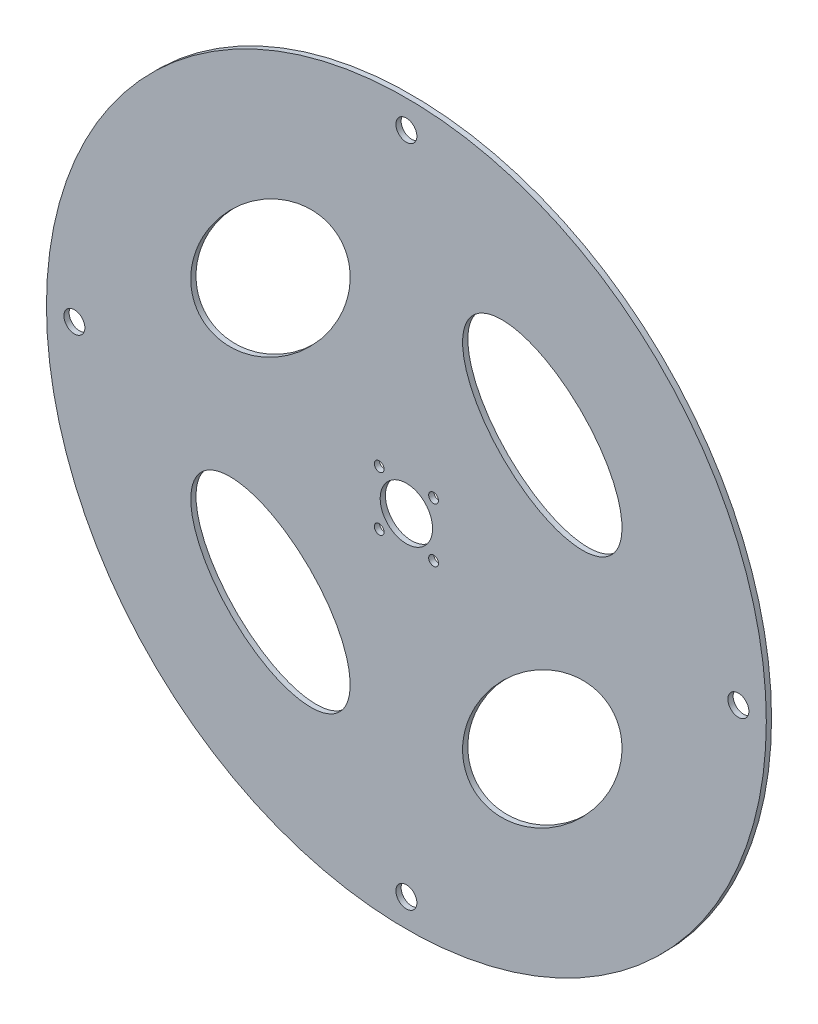
ISO-10303-21;
HEADER;
FILE_DESCRIPTION(('STEP AP214'),'2;1');
FILE_NAME('part.step','',(''),(''),'','','');
FILE_SCHEMA(('AUTOMOTIVE_DESIGN { 1 0 10303 214 1 1 1 1 }'));
ENDSEC;
DATA;
#1=APPLICATION_CONTEXT('core data for automotive mechanical design processes');
#2=APPLICATION_PROTOCOL_DEFINITION('international standard','automotive_design',2000,#1);
#3=PRODUCT_CONTEXT('',#1,'mechanical');
#4=PRODUCT('Part','Part','',(#3));
#5=PRODUCT_RELATED_PRODUCT_CATEGORY('part','',(#4));
#6=PRODUCT_DEFINITION_FORMATION('','',#4);
#7=PRODUCT_DEFINITION_CONTEXT('part definition',#1,'design');
#8=PRODUCT_DEFINITION('design','',#6,#7);
#9=PRODUCT_DEFINITION_SHAPE('','',#8);
#10=(LENGTH_UNIT() NAMED_UNIT(*) SI_UNIT(.MILLI.,.METRE.));
#11=(NAMED_UNIT(*) PLANE_ANGLE_UNIT() SI_UNIT($,.RADIAN.));
#12=(NAMED_UNIT(*) SI_UNIT($,.STERADIAN.) SOLID_ANGLE_UNIT());
#13=UNCERTAINTY_MEASURE_WITH_UNIT(LENGTH_MEASURE(1.E-05),#10,'distance_accuracy_value','');
#14=(GEOMETRIC_REPRESENTATION_CONTEXT(3) GLOBAL_UNCERTAINTY_ASSIGNED_CONTEXT((#13)) GLOBAL_UNIT_ASSIGNED_CONTEXT((#10,
#11,#12)) REPRESENTATION_CONTEXT('',''));
#15=CARTESIAN_POINT('',(0.,0.,0.));
#16=DIRECTION('',(0.,0.,1.));
#17=DIRECTION('',(1.,0.,0.));
#18=AXIS2_PLACEMENT_3D('',#15,#16,#17);
#19=CARTESIAN_POINT('',(0.,0.,1.5));
#20=DIRECTION('',(0.,0.,-1.));
#21=DIRECTION('',(-1.,0.,0.));
#22=AXIS2_PLACEMENT_3D('',#19,#20,#21);
#23=CYLINDRICAL_SURFACE('',#22,103.);
#24=CARTESIAN_POINT('',(0.,0.,1.5));
#25=DIRECTION('',(0.,0.,1.));
#26=DIRECTION('',(1.,0.,0.));
#27=AXIS2_PLACEMENT_3D('',#24,#25,#26);
#28=CIRCLE('',#27,103.);
#29=CARTESIAN_POINT('',(103.,0.,1.5));
#30=VERTEX_POINT('',#29);
#31=EDGE_CURVE('E10',#30,#30,#28,.T.);
#32=ORIENTED_EDGE('',*,*,#31,.F.);
#33=EDGE_LOOP('',(#32));
#34=FACE_BOUND('',#33,.T.);
#35=CARTESIAN_POINT('',(0.,0.,0.));
#36=DIRECTION('',(0.,0.,1.));
#37=DIRECTION('',(1.,0.,0.));
#38=AXIS2_PLACEMENT_3D('',#35,#36,#37);
#39=CIRCLE('',#38,103.);
#40=CARTESIAN_POINT('',(103.,0.,0.));
#41=VERTEX_POINT('',#40);
#42=EDGE_CURVE('E37',#41,#41,#39,.T.);
#43=ORIENTED_EDGE('',*,*,#42,.T.);
#44=EDGE_LOOP('',(#43));
#45=FACE_BOUND('',#44,.T.);
#46=ADVANCED_FACE('F40',(#34,#45),#23,.T.);
#47=CARTESIAN_POINT('',(0.,0.,1.5));
#48=DIRECTION('',(0.,0.,1.));
#49=DIRECTION('',(1.,0.,0.));
#50=AXIS2_PLACEMENT_3D('',#47,#48,#49);
#51=PLANE('',#50);
#52=CARTESIAN_POINT('',(7.77817459305194,-7.7781745930521,1.5));
#53=DIRECTION('',(0.,0.,1.));
#54=DIRECTION('',(1.,0.,0.));
#55=AXIS2_PLACEMENT_3D('',#52,#53,#54);
#56=CIRCLE('',#55,1.4);
#57=CARTESIAN_POINT('',(9.17817459305194,-7.7781745930521,1.5));
#58=VERTEX_POINT('',#57);
#59=EDGE_CURVE('E307',#58,#58,#56,.T.);
#60=ORIENTED_EDGE('',*,*,#59,.F.);
#61=EDGE_LOOP('',(#60));
#62=FACE_BOUND('',#61,.T.);
#63=CARTESIAN_POINT('',(7.77817459305208,7.77817459305197,1.5));
#64=DIRECTION('',(0.,0.,1.));
#65=DIRECTION('',(1.,0.,0.));
#66=AXIS2_PLACEMENT_3D('',#63,#64,#65);
#67=CIRCLE('',#66,1.4);
#68=CARTESIAN_POINT('',(9.17817459305208,7.77817459305197,1.5));
#69=VERTEX_POINT('',#68);
#70=EDGE_CURVE('E312',#69,#69,#67,.T.);
#71=ORIENTED_EDGE('',*,*,#70,.F.);
#72=EDGE_LOOP('',(#71));
#73=FACE_BOUND('',#72,.T.);
#74=CARTESIAN_POINT('',(-7.77817459305199,7.77817459305205,1.5));
#75=DIRECTION('',(0.,0.,1.));
#76=DIRECTION('',(1.,0.,0.));
#77=AXIS2_PLACEMENT_3D('',#74,#75,#76);
#78=CIRCLE('',#77,1.4);
#79=CARTESIAN_POINT('',(-6.378174593052,7.77817459305205,1.5));
#80=VERTEX_POINT('',#79);
#81=EDGE_CURVE('E316',#80,#80,#78,.T.);
#82=ORIENTED_EDGE('',*,*,#81,.F.);
#83=EDGE_LOOP('',(#82));
#84=FACE_BOUND('',#83,.T.);
#85=CARTESIAN_POINT('',(-7.77817459305202,-7.77817459305202,1.5));
#86=DIRECTION('',(0.,0.,1.));
#87=DIRECTION('',(1.,0.,0.));
#88=AXIS2_PLACEMENT_3D('',#85,#86,#87);
#89=CIRCLE('',#88,1.4);
#90=CARTESIAN_POINT('',(-6.37817459305202,-7.77817459305202,1.5));
#91=VERTEX_POINT('',#90);
#92=EDGE_CURVE('E254',#91,#91,#89,.T.);
#93=ORIENTED_EDGE('',*,*,#92,.F.);
#94=EDGE_LOOP('',(#93));
#95=FACE_BOUND('',#94,.T.);
#96=CARTESIAN_POINT('',(38.8908729652602,38.89087296526,1.5));
#97=DIRECTION('',(0.,0.,-1.));
#98=DIRECTION('',(0.707106781186545,-0.70710678118655,0.));
#99=AXIS2_PLACEMENT_3D('',#96,#97,#98);
#100=ELLIPSE('',#99,28.,16.);
#101=CARTESIAN_POINT('',(58.6898628384835,19.0918830920366,1.5));
#102=VERTEX_POINT('',#101);
#103=EDGE_CURVE('E230',#102,#102,#100,.T.);
#104=ORIENTED_EDGE('',*,*,#103,.T.);
#105=EDGE_LOOP('',(#104));
#106=FACE_BOUND('',#105,.T.);
#107=CARTESIAN_POINT('',(38.8908729652601,-38.8908729652601,1.5));
#108=DIRECTION('',(0.,0.,-1.));
#109=DIRECTION('',(-0.707106781186547,-0.707106781186548,0.));
#110=AXIS2_PLACEMENT_3D('',#107,#108,#109);
#111=ELLIPSE('',#110,28.,16.);
#112=CARTESIAN_POINT('',(19.0918830920368,-58.6898628384834,1.5));
#113=VERTEX_POINT('',#112);
#114=EDGE_CURVE('E237',#113,#113,#111,.T.);
#115=ORIENTED_EDGE('',*,*,#114,.T.);
#116=EDGE_LOOP('',(#115));
#117=FACE_BOUND('',#116,.T.);
#118=CARTESIAN_POINT('',(-38.8908729652605,-38.8908729652597,1.5));
#119=DIRECTION('',(0.,0.,-1.));
#120=DIRECTION('',(-0.70710678118654,0.707106781186555,0.));
#121=AXIS2_PLACEMENT_3D('',#118,#119,#120);
#122=ELLIPSE('',#121,28.,16.);
#123=CARTESIAN_POINT('',(-58.6898628384836,-19.0918830920362,1.5));
#124=VERTEX_POINT('',#123);
#125=EDGE_CURVE('E246',#124,#124,#122,.T.);
#126=ORIENTED_EDGE('',*,*,#125,.T.);
#127=EDGE_LOOP('',(#126));
#128=FACE_BOUND('',#127,.T.);
#129=CARTESIAN_POINT('',(3.31690727190098E-13,95.,1.5));
#130=DIRECTION('',(0.,0.,-1.));
#131=DIRECTION('',(0.,1.,0.));
#132=AXIS2_PLACEMENT_3D('',#129,#130,#131);
#133=CIRCLE('',#132,3.00000000000001);
#134=CARTESIAN_POINT('',(3.42165171206627E-13,98.,1.5));
#135=VERTEX_POINT('',#134);
#136=EDGE_CURVE('E251',#135,#135,#133,.T.);
#137=ORIENTED_EDGE('',*,*,#136,.T.);
#138=EDGE_LOOP('',(#137));
#139=FACE_BOUND('',#138,.T.);
#140=CARTESIAN_POINT('',(95.,0.,1.5));
#141=DIRECTION('',(0.,0.,-1.));
#142=DIRECTION('',(1.,0.,0.));
#143=AXIS2_PLACEMENT_3D('',#140,#141,#142);
#144=CIRCLE('',#143,3.00000000000001);
#145=CARTESIAN_POINT('',(98.,0.,1.5));
#146=VERTEX_POINT('',#145);
#147=EDGE_CURVE('E258',#146,#146,#144,.T.);
#148=ORIENTED_EDGE('',*,*,#147,.T.);
#149=EDGE_LOOP('',(#148));
#150=FACE_BOUND('',#149,.T.);
#151=CARTESIAN_POINT('',(-9.95072181570293E-13,-95.,1.5));
#152=DIRECTION('',(0.,0.,-1.));
#153=DIRECTION('',(0.,-1.,0.));
#154=AXIS2_PLACEMENT_3D('',#151,#152,#153);
#155=CIRCLE('',#154,3.00000000000001);
#156=CARTESIAN_POINT('',(-1.02649551361988E-12,-98.,1.5));
#157=VERTEX_POINT('',#156);
#158=EDGE_CURVE('E266',#157,#157,#155,.T.);
#159=ORIENTED_EDGE('',*,*,#158,.T.);
#160=EDGE_LOOP('',(#159));
#161=FACE_BOUND('',#160,.T.);
#162=CARTESIAN_POINT('',(0.,0.,1.5));
#163=DIRECTION('',(0.,0.,-1.));
#164=DIRECTION('',(-1.,0.,0.));
#165=AXIS2_PLACEMENT_3D('',#162,#163,#164);
#166=CIRCLE('',#165,7.5);
#167=CARTESIAN_POINT('',(-7.5,0.,1.5));
#168=VERTEX_POINT('',#167);
#169=EDGE_CURVE('E59',#168,#168,#166,.T.);
#170=ORIENTED_EDGE('',*,*,#169,.T.);
#171=EDGE_LOOP('',(#170));
#172=FACE_BOUND('',#171,.T.);
#173=CARTESIAN_POINT('',(-38.8908729652601,38.8908729652601,1.5));
#174=DIRECTION('',(0.,0.,-1.));
#175=DIRECTION('',(0.707106781186547,0.707106781186548,0.));
#176=AXIS2_PLACEMENT_3D('',#173,#174,#175);
#177=ELLIPSE('',#176,28.,16.);
#178=CARTESIAN_POINT('',(-19.0918830920368,58.6898628384834,1.5));
#179=VERTEX_POINT('',#178);
#180=EDGE_CURVE('E55',#179,#179,#177,.T.);
#181=ORIENTED_EDGE('',*,*,#180,.T.);
#182=EDGE_LOOP('',(#181));
#183=FACE_BOUND('',#182,.T.);
#184=CARTESIAN_POINT('',(-95.,0.,1.5));
#185=DIRECTION('',(0.,0.,-1.));
#186=DIRECTION('',(-1.,0.,0.));
#187=AXIS2_PLACEMENT_3D('',#184,#185,#186);
#188=CIRCLE('',#187,3.00000000000001);
#189=CARTESIAN_POINT('',(-98.,0.,1.5));
#190=VERTEX_POINT('',#189);
#191=EDGE_CURVE('E50',#190,#190,#188,.T.);
#192=ORIENTED_EDGE('',*,*,#191,.T.);
#193=EDGE_LOOP('',(#192));
#194=FACE_BOUND('',#193,.T.);
#195=ORIENTED_EDGE('',*,*,#31,.T.);
#196=EDGE_LOOP('',(#195));
#197=FACE_BOUND('',#196,.T.);
#198=ADVANCED_FACE('F80',(#62,#73,#84,#95,#106,#117,#128,#139,#150,#161,#172,#183,#194,#197),
#51,.T.);
#199=CARTESIAN_POINT('',(0.,0.,0.));
#200=DIRECTION('',(0.,0.,1.));
#201=DIRECTION('',(1.,0.,0.));
#202=AXIS2_PLACEMENT_3D('',#199,#200,#201);
#203=PLANE('',#202);
#204=CARTESIAN_POINT('',(7.77817459305194,-7.7781745930521,0.));
#205=DIRECTION('',(0.,0.,1.));
#206=DIRECTION('',(1.,0.,0.));
#207=AXIS2_PLACEMENT_3D('',#204,#205,#206);
#208=CIRCLE('',#207,1.4);
#209=CARTESIAN_POINT('',(9.17817459305194,-7.7781745930521,0.));
#210=VERTEX_POINT('',#209);
#211=EDGE_CURVE('E311',#210,#210,#208,.T.);
#212=ORIENTED_EDGE('',*,*,#211,.T.);
#213=EDGE_LOOP('',(#212));
#214=FACE_BOUND('',#213,.T.);
#215=CARTESIAN_POINT('',(7.77817459305208,7.77817459305197,0.));
#216=DIRECTION('',(0.,0.,1.));
#217=DIRECTION('',(1.,0.,0.));
#218=AXIS2_PLACEMENT_3D('',#215,#216,#217);
#219=CIRCLE('',#218,1.4);
#220=CARTESIAN_POINT('',(9.17817459305208,7.77817459305197,0.));
#221=VERTEX_POINT('',#220);
#222=EDGE_CURVE('E317',#221,#221,#219,.T.);
#223=ORIENTED_EDGE('',*,*,#222,.T.);
#224=EDGE_LOOP('',(#223));
#225=FACE_BOUND('',#224,.T.);
#226=CARTESIAN_POINT('',(-7.77817459305199,7.77817459305205,0.));
#227=DIRECTION('',(0.,0.,1.));
#228=DIRECTION('',(1.,0.,0.));
#229=AXIS2_PLACEMENT_3D('',#226,#227,#228);
#230=CIRCLE('',#229,1.4);
#231=CARTESIAN_POINT('',(-6.378174593052,7.77817459305205,0.));
#232=VERTEX_POINT('',#231);
#233=EDGE_CURVE('E310',#232,#232,#230,.T.);
#234=ORIENTED_EDGE('',*,*,#233,.T.);
#235=EDGE_LOOP('',(#234));
#236=FACE_BOUND('',#235,.T.);
#237=CARTESIAN_POINT('',(-7.77817459305202,-7.77817459305202,0.));
#238=DIRECTION('',(0.,0.,1.));
#239=DIRECTION('',(1.,0.,0.));
#240=AXIS2_PLACEMENT_3D('',#237,#238,#239);
#241=CIRCLE('',#240,1.4);
#242=CARTESIAN_POINT('',(-6.37817459305202,-7.77817459305202,0.));
#243=VERTEX_POINT('',#242);
#244=EDGE_CURVE('E236',#243,#243,#241,.T.);
#245=ORIENTED_EDGE('',*,*,#244,.T.);
#246=EDGE_LOOP('',(#245));
#247=FACE_BOUND('',#246,.T.);
#248=CARTESIAN_POINT('',(38.8908729652602,38.89087296526,0.));
#249=DIRECTION('',(0.,0.,-1.));
#250=DIRECTION('',(0.707106781186545,-0.70710678118655,0.));
#251=AXIS2_PLACEMENT_3D('',#248,#249,#250);
#252=ELLIPSE('',#251,28.,16.);
#253=CARTESIAN_POINT('',(58.6898628384835,19.0918830920366,0.));
#254=VERTEX_POINT('',#253);
#255=EDGE_CURVE('E232',#254,#254,#252,.T.);
#256=ORIENTED_EDGE('',*,*,#255,.F.);
#257=EDGE_LOOP('',(#256));
#258=FACE_BOUND('',#257,.T.);
#259=CARTESIAN_POINT('',(38.8908729652601,-38.8908729652601,0.));
#260=DIRECTION('',(0.,0.,-1.));
#261=DIRECTION('',(-0.707106781186547,-0.707106781186548,0.));
#262=AXIS2_PLACEMENT_3D('',#259,#260,#261);
#263=ELLIPSE('',#262,28.,16.);
#264=CARTESIAN_POINT('',(19.0918830920368,-58.6898628384834,0.));
#265=VERTEX_POINT('',#264);
#266=EDGE_CURVE('E243',#265,#265,#263,.T.);
#267=ORIENTED_EDGE('',*,*,#266,.F.);
#268=EDGE_LOOP('',(#267));
#269=FACE_BOUND('',#268,.T.);
#270=CARTESIAN_POINT('',(-38.8908729652605,-38.8908729652597,0.));
#271=DIRECTION('',(0.,0.,-1.));
#272=DIRECTION('',(-0.70710678118654,0.707106781186555,0.));
#273=AXIS2_PLACEMENT_3D('',#270,#271,#272);
#274=ELLIPSE('',#273,28.,16.);
#275=CARTESIAN_POINT('',(-58.6898628384836,-19.0918830920362,0.));
#276=VERTEX_POINT('',#275);
#277=EDGE_CURVE('E249',#276,#276,#274,.T.);
#278=ORIENTED_EDGE('',*,*,#277,.F.);
#279=EDGE_LOOP('',(#278));
#280=FACE_BOUND('',#279,.T.);
#281=CARTESIAN_POINT('',(3.31690727190098E-13,95.,0.));
#282=DIRECTION('',(0.,0.,-1.));
#283=DIRECTION('',(0.,1.,0.));
#284=AXIS2_PLACEMENT_3D('',#281,#282,#283);
#285=CIRCLE('',#284,3.00000000000001);
#286=CARTESIAN_POINT('',(3.42165171206627E-13,98.,0.));
#287=VERTEX_POINT('',#286);
#288=EDGE_CURVE('E260',#287,#287,#285,.T.);
#289=ORIENTED_EDGE('',*,*,#288,.F.);
#290=EDGE_LOOP('',(#289));
#291=FACE_BOUND('',#290,.T.);
#292=CARTESIAN_POINT('',(95.,0.,0.));
#293=DIRECTION('',(0.,0.,-1.));
#294=DIRECTION('',(1.,0.,0.));
#295=AXIS2_PLACEMENT_3D('',#292,#293,#294);
#296=CIRCLE('',#295,3.00000000000001);
#297=CARTESIAN_POINT('',(98.,0.,0.));
#298=VERTEX_POINT('',#297);
#299=EDGE_CURVE('E262',#298,#298,#296,.T.);
#300=ORIENTED_EDGE('',*,*,#299,.F.);
#301=EDGE_LOOP('',(#300));
#302=FACE_BOUND('',#301,.T.);
#303=CARTESIAN_POINT('',(-9.95072181570293E-13,-95.,0.));
#304=DIRECTION('',(0.,0.,-1.));
#305=DIRECTION('',(0.,-1.,0.));
#306=AXIS2_PLACEMENT_3D('',#303,#304,#305);
#307=CIRCLE('',#306,3.00000000000001);
#308=CARTESIAN_POINT('',(-1.02649551361988E-12,-98.,0.));
#309=VERTEX_POINT('',#308);
#310=EDGE_CURVE('E234',#309,#309,#307,.T.);
#311=ORIENTED_EDGE('',*,*,#310,.F.);
#312=EDGE_LOOP('',(#311));
#313=FACE_BOUND('',#312,.T.);
#314=CARTESIAN_POINT('',(0.,0.,0.));
#315=DIRECTION('',(0.,0.,-1.));
#316=DIRECTION('',(-1.,0.,0.));
#317=AXIS2_PLACEMENT_3D('',#314,#315,#316);
#318=CIRCLE('',#317,7.5);
#319=CARTESIAN_POINT('',(-7.5,0.,0.));
#320=VERTEX_POINT('',#319);
#321=EDGE_CURVE('E65',#320,#320,#318,.T.);
#322=ORIENTED_EDGE('',*,*,#321,.F.);
#323=EDGE_LOOP('',(#322));
#324=FACE_BOUND('',#323,.T.);
#325=CARTESIAN_POINT('',(-38.8908729652601,38.8908729652601,0.));
#326=DIRECTION('',(0.,0.,-1.));
#327=DIRECTION('',(0.707106781186547,0.707106781186548,0.));
#328=AXIS2_PLACEMENT_3D('',#325,#326,#327);
#329=ELLIPSE('',#328,28.,16.);
#330=CARTESIAN_POINT('',(-19.0918830920368,58.6898628384834,0.));
#331=VERTEX_POINT('',#330);
#332=EDGE_CURVE('E54',#331,#331,#329,.T.);
#333=ORIENTED_EDGE('',*,*,#332,.F.);
#334=EDGE_LOOP('',(#333));
#335=FACE_BOUND('',#334,.T.);
#336=CARTESIAN_POINT('',(-95.,0.,0.));
#337=DIRECTION('',(0.,0.,-1.));
#338=DIRECTION('',(-1.,0.,0.));
#339=AXIS2_PLACEMENT_3D('',#336,#337,#338);
#340=CIRCLE('',#339,3.00000000000001);
#341=CARTESIAN_POINT('',(-98.,0.,0.));
#342=VERTEX_POINT('',#341);
#343=EDGE_CURVE('E47',#342,#342,#340,.T.);
#344=ORIENTED_EDGE('',*,*,#343,.F.);
#345=EDGE_LOOP('',(#344));
#346=FACE_BOUND('',#345,.T.);
#347=ORIENTED_EDGE('',*,*,#42,.F.);
#348=EDGE_LOOP('',(#347));
#349=FACE_BOUND('',#348,.T.);
#350=ADVANCED_FACE('F75',(#214,#225,#236,#247,#258,#269,#280,#291,#302,#313,#324,#335,#346,
#349),#203,.F.);
#351=CARTESIAN_POINT('',(-95.,0.,1.5));
#352=DIRECTION('',(0.,0.,-1.));
#353=DIRECTION('',(-1.,0.,0.));
#354=AXIS2_PLACEMENT_3D('',#351,#352,#353);
#355=CYLINDRICAL_SURFACE('',#354,3.00000000000001);
#356=ORIENTED_EDGE('',*,*,#191,.F.);
#357=EDGE_LOOP('',(#356));
#358=FACE_BOUND('',#357,.T.);
#359=ORIENTED_EDGE('',*,*,#343,.T.);
#360=EDGE_LOOP('',(#359));
#361=FACE_BOUND('',#360,.T.);
#362=ADVANCED_FACE('F66',(#358,#361),#355,.F.);
#363=DIRECTION('',(0.,0.,-1.));
#364=VECTOR('',#363,1.);
#365=SURFACE_OF_LINEAR_EXTRUSION('',#177,#364);
#366=ORIENTED_EDGE('',*,*,#180,.F.);
#367=EDGE_LOOP('',(#366));
#368=FACE_BOUND('',#367,.T.);
#369=ORIENTED_EDGE('',*,*,#332,.T.);
#370=EDGE_LOOP('',(#369));
#371=FACE_BOUND('',#370,.T.);
#372=ADVANCED_FACE('F63',(#368,#371),#365,.F.);
#373=CARTESIAN_POINT('',(0.,0.,1.5));
#374=DIRECTION('',(0.,0.,-1.));
#375=DIRECTION('',(-1.,0.,0.));
#376=AXIS2_PLACEMENT_3D('',#373,#374,#375);
#377=CYLINDRICAL_SURFACE('',#376,7.5);
#378=ORIENTED_EDGE('',*,*,#169,.F.);
#379=EDGE_LOOP('',(#378));
#380=FACE_BOUND('',#379,.T.);
#381=ORIENTED_EDGE('',*,*,#321,.T.);
#382=EDGE_LOOP('',(#381));
#383=FACE_BOUND('',#382,.T.);
#384=ADVANCED_FACE('F70',(#380,#383),#377,.F.);
#385=CARTESIAN_POINT('',(-9.95072181570293E-13,-95.,1.5));
#386=DIRECTION('',(0.,0.,-1.));
#387=DIRECTION('',(-1.,0.,0.));
#388=AXIS2_PLACEMENT_3D('',#385,#386,#387);
#389=CYLINDRICAL_SURFACE('',#388,3.00000000000001);
#390=ORIENTED_EDGE('',*,*,#158,.F.);
#391=EDGE_LOOP('',(#390));
#392=FACE_BOUND('',#391,.T.);
#393=ORIENTED_EDGE('',*,*,#310,.T.);
#394=EDGE_LOOP('',(#393));
#395=FACE_BOUND('',#394,.T.);
#396=ADVANCED_FACE('F115',(#392,#395),#389,.F.);
#397=CARTESIAN_POINT('',(95.,0.,1.5));
#398=DIRECTION('',(0.,0.,-1.));
#399=DIRECTION('',(-1.,0.,0.));
#400=AXIS2_PLACEMENT_3D('',#397,#398,#399);
#401=CYLINDRICAL_SURFACE('',#400,3.00000000000001);
#402=ORIENTED_EDGE('',*,*,#147,.F.);
#403=EDGE_LOOP('',(#402));
#404=FACE_BOUND('',#403,.T.);
#405=ORIENTED_EDGE('',*,*,#299,.T.);
#406=EDGE_LOOP('',(#405));
#407=FACE_BOUND('',#406,.T.);
#408=ADVANCED_FACE('F119',(#404,#407),#401,.F.);
#409=CARTESIAN_POINT('',(3.31690727190098E-13,95.,1.5));
#410=DIRECTION('',(0.,0.,-1.));
#411=DIRECTION('',(-1.,0.,0.));
#412=AXIS2_PLACEMENT_3D('',#409,#410,#411);
#413=CYLINDRICAL_SURFACE('',#412,3.00000000000001);
#414=ORIENTED_EDGE('',*,*,#136,.F.);
#415=EDGE_LOOP('',(#414));
#416=FACE_BOUND('',#415,.T.);
#417=ORIENTED_EDGE('',*,*,#288,.T.);
#418=EDGE_LOOP('',(#417));
#419=FACE_BOUND('',#418,.T.);
#420=ADVANCED_FACE('F129',(#416,#419),#413,.F.);
#421=DIRECTION('',(0.,0.,-1.));
#422=VECTOR('',#421,1.);
#423=SURFACE_OF_LINEAR_EXTRUSION('',#122,#422);
#424=ORIENTED_EDGE('',*,*,#125,.F.);
#425=EDGE_LOOP('',(#424));
#426=FACE_BOUND('',#425,.T.);
#427=ORIENTED_EDGE('',*,*,#277,.T.);
#428=EDGE_LOOP('',(#427));
#429=FACE_BOUND('',#428,.T.);
#430=ADVANCED_FACE('F137',(#426,#429),#423,.F.);
#431=DIRECTION('',(0.,0.,-1.));
#432=VECTOR('',#431,1.);
#433=SURFACE_OF_LINEAR_EXTRUSION('',#111,#432);
#434=ORIENTED_EDGE('',*,*,#114,.F.);
#435=EDGE_LOOP('',(#434));
#436=FACE_BOUND('',#435,.T.);
#437=ORIENTED_EDGE('',*,*,#266,.T.);
#438=EDGE_LOOP('',(#437));
#439=FACE_BOUND('',#438,.T.);
#440=ADVANCED_FACE('F147',(#436,#439),#433,.F.);
#441=DIRECTION('',(0.,0.,-1.));
#442=VECTOR('',#441,1.);
#443=SURFACE_OF_LINEAR_EXTRUSION('',#100,#442);
#444=ORIENTED_EDGE('',*,*,#103,.F.);
#445=EDGE_LOOP('',(#444));
#446=FACE_BOUND('',#445,.T.);
#447=ORIENTED_EDGE('',*,*,#255,.T.);
#448=EDGE_LOOP('',(#447));
#449=FACE_BOUND('',#448,.T.);
#450=ADVANCED_FACE('F151',(#446,#449),#443,.F.);
#451=CARTESIAN_POINT('',(-7.77817459305202,-7.77817459305202,1.5));
#452=DIRECTION('',(0.,0.,-1.));
#453=DIRECTION('',(-1.,0.,0.));
#454=AXIS2_PLACEMENT_3D('',#451,#452,#453);
#455=CYLINDRICAL_SURFACE('',#454,1.4);
#456=ORIENTED_EDGE('',*,*,#92,.T.);
#457=EDGE_LOOP('',(#456));
#458=FACE_BOUND('',#457,.T.);
#459=ORIENTED_EDGE('',*,*,#244,.F.);
#460=EDGE_LOOP('',(#459));
#461=FACE_BOUND('',#460,.T.);
#462=ADVANCED_FACE('F161',(#458,#461),#455,.F.);
#463=CARTESIAN_POINT('',(-7.77817459305199,7.77817459305205,1.5));
#464=DIRECTION('',(0.,0.,-1.));
#465=DIRECTION('',(-1.,0.,0.));
#466=AXIS2_PLACEMENT_3D('',#463,#464,#465);
#467=CYLINDRICAL_SURFACE('',#466,1.4);
#468=ORIENTED_EDGE('',*,*,#81,.T.);
#469=EDGE_LOOP('',(#468));
#470=FACE_BOUND('',#469,.T.);
#471=ORIENTED_EDGE('',*,*,#233,.F.);
#472=EDGE_LOOP('',(#471));
#473=FACE_BOUND('',#472,.T.);
#474=ADVANCED_FACE('F192',(#470,#473),#467,.F.);
#475=CARTESIAN_POINT('',(7.77817459305208,7.77817459305197,1.5));
#476=DIRECTION('',(0.,0.,-1.));
#477=DIRECTION('',(-1.,0.,0.));
#478=AXIS2_PLACEMENT_3D('',#475,#476,#477);
#479=CYLINDRICAL_SURFACE('',#478,1.4);
#480=ORIENTED_EDGE('',*,*,#70,.T.);
#481=EDGE_LOOP('',(#480));
#482=FACE_BOUND('',#481,.T.);
#483=ORIENTED_EDGE('',*,*,#222,.F.);
#484=EDGE_LOOP('',(#483));
#485=FACE_BOUND('',#484,.T.);
#486=ADVANCED_FACE('F196',(#482,#485),#479,.F.);
#487=CARTESIAN_POINT('',(7.77817459305194,-7.7781745930521,1.5));
#488=DIRECTION('',(0.,0.,-1.));
#489=DIRECTION('',(-1.,0.,0.));
#490=AXIS2_PLACEMENT_3D('',#487,#488,#489);
#491=CYLINDRICAL_SURFACE('',#490,1.4);
#492=ORIENTED_EDGE('',*,*,#59,.T.);
#493=EDGE_LOOP('',(#492));
#494=FACE_BOUND('',#493,.T.);
#495=ORIENTED_EDGE('',*,*,#211,.F.);
#496=EDGE_LOOP('',(#495));
#497=FACE_BOUND('',#496,.T.);
#498=ADVANCED_FACE('F209',(#494,#497),#491,.F.);
#499=CLOSED_SHELL('',(#46,#198,#350,#362,#372,#384,#396,#408,#420,#430,#440,#450,#462,#474,#486,#498));
#500=MANIFOLD_SOLID_BREP('B2',#499);
#501=ADVANCED_BREP_SHAPE_REPRESENTATION('',(#18,#500),#14);
#502=SHAPE_DEFINITION_REPRESENTATION(#9,#501);
ENDSEC;
END-ISO-10303-21;
